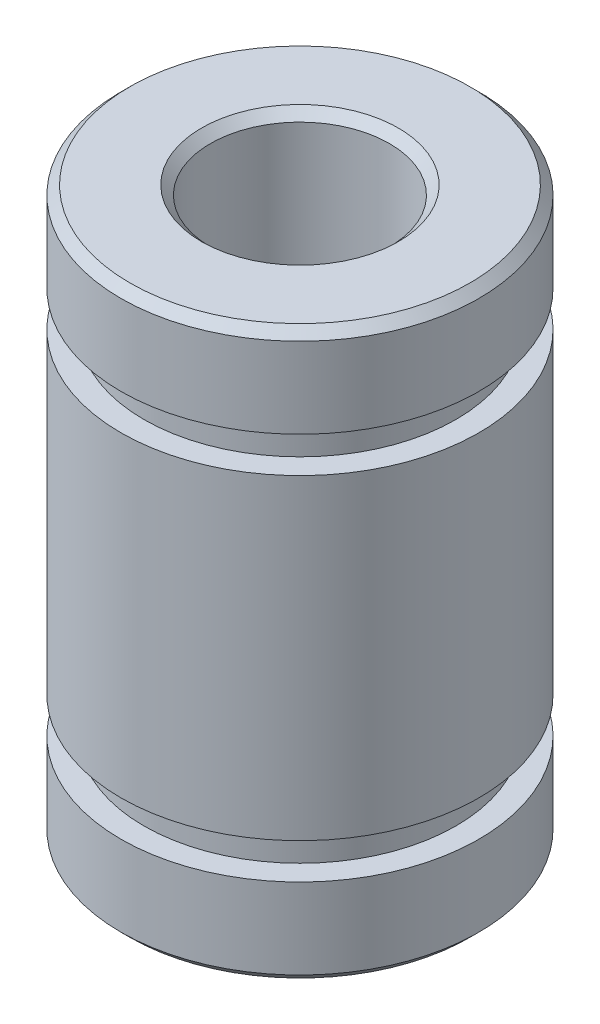
ISO-10303-21;
HEADER;
FILE_DESCRIPTION(('STEP AP214'),'2;1');
FILE_NAME('part.step','',(''),(''),'','','');
FILE_SCHEMA(('AUTOMOTIVE_DESIGN { 1 0 10303 214 1 1 1 1 }'));
ENDSEC;
DATA;
#1=APPLICATION_CONTEXT('core data for automotive mechanical design processes');
#2=APPLICATION_PROTOCOL_DEFINITION('international standard','automotive_design',2000,#1);
#3=PRODUCT_CONTEXT('',#1,'mechanical');
#4=PRODUCT('Part','Part','',(#3));
#5=PRODUCT_RELATED_PRODUCT_CATEGORY('part','',(#4));
#6=PRODUCT_DEFINITION_FORMATION('','',#4);
#7=PRODUCT_DEFINITION_CONTEXT('part definition',#1,'design');
#8=PRODUCT_DEFINITION('design','',#6,#7);
#9=PRODUCT_DEFINITION_SHAPE('','',#8);
#10=(LENGTH_UNIT() NAMED_UNIT(*) SI_UNIT(.MILLI.,.METRE.));
#11=(NAMED_UNIT(*) PLANE_ANGLE_UNIT() SI_UNIT($,.RADIAN.));
#12=(NAMED_UNIT(*) SI_UNIT($,.STERADIAN.) SOLID_ANGLE_UNIT());
#13=UNCERTAINTY_MEASURE_WITH_UNIT(LENGTH_MEASURE(1.E-05),#10,'distance_accuracy_value','');
#14=(GEOMETRIC_REPRESENTATION_CONTEXT(3) GLOBAL_UNCERTAINTY_ASSIGNED_CONTEXT((#13)) GLOBAL_UNIT_ASSIGNED_CONTEXT((#10,
#11,#12)) REPRESENTATION_CONTEXT('',''));
#15=CARTESIAN_POINT('',(0.,0.,0.));
#16=DIRECTION('',(0.,0.,1.));
#17=DIRECTION('',(1.,0.,0.));
#18=AXIS2_PLACEMENT_3D('',#15,#16,#17);
#19=CARTESIAN_POINT('',(0.,9.5,0.));
#20=DIRECTION('',(0.,-1.,0.));
#21=DIRECTION('',(0.,0.,-1.));
#22=AXIS2_PLACEMENT_3D('',#19,#20,#21);
#23=CYLINDRICAL_SURFACE('',#22,6.);
#24=CARTESIAN_POINT('',(0.,9.2,0.));
#25=DIRECTION('',(0.,1.,0.));
#26=DIRECTION('',(0.,0.,1.));
#27=AXIS2_PLACEMENT_3D('',#24,#25,#26);
#28=CIRCLE('',#27,6.);
#29=CARTESIAN_POINT('',(0.,9.2,6.));
#30=VERTEX_POINT('',#29);
#31=EDGE_CURVE('E10',#30,#30,#28,.F.);
#32=ORIENTED_EDGE('',*,*,#31,.T.);
#33=EDGE_LOOP('',(#32));
#34=FACE_BOUND('',#33,.T.);
#35=CARTESIAN_POINT('',(0.,6.5,0.));
#36=DIRECTION('',(0.,1.,0.));
#37=DIRECTION('',(0.,0.,1.));
#38=AXIS2_PLACEMENT_3D('',#35,#36,#37);
#39=CIRCLE('',#38,6.);
#40=CARTESIAN_POINT('',(0.,6.5,6.));
#41=VERTEX_POINT('',#40);
#42=EDGE_CURVE('E73',#41,#41,#39,.T.);
#43=ORIENTED_EDGE('',*,*,#42,.T.);
#44=EDGE_LOOP('',(#43));
#45=FACE_BOUND('',#44,.T.);
#46=ADVANCED_FACE('F36',(#34,#45),#23,.T.);
#47=CARTESIAN_POINT('',(0.,-9.19999999999999,0.));
#48=DIRECTION('',(0.,1.,0.));
#49=DIRECTION('',(0.,0.,1.));
#50=AXIS2_PLACEMENT_3D('',#47,#48,#49);
#51=CIRCLE('',#50,6.);
#52=CARTESIAN_POINT('',(0.,-9.2,6.));
#53=VERTEX_POINT('',#52);
#54=EDGE_CURVE('E52',#53,#53,#51,.T.);
#55=ORIENTED_EDGE('',*,*,#54,.T.);
#56=EDGE_LOOP('',(#55));
#57=FACE_BOUND('',#56,.T.);
#58=CARTESIAN_POINT('',(0.,-6.5,0.));
#59=DIRECTION('',(0.,1.,0.));
#60=DIRECTION('',(0.,0.,1.));
#61=AXIS2_PLACEMENT_3D('',#58,#59,#60);
#62=CIRCLE('',#61,6.);
#63=CARTESIAN_POINT('',(0.,-6.5,6.));
#64=VERTEX_POINT('',#63);
#65=EDGE_CURVE('E80',#64,#64,#62,.T.);
#66=ORIENTED_EDGE('',*,*,#65,.F.);
#67=EDGE_LOOP('',(#66));
#68=FACE_BOUND('',#67,.T.);
#69=ADVANCED_FACE('F112',(#57,#68),#23,.T.);
#70=CARTESIAN_POINT('',(0.,9.5,0.));
#71=DIRECTION('',(0.,1.,0.));
#72=DIRECTION('',(0.,0.,1.));
#73=AXIS2_PLACEMENT_3D('',#70,#71,#72);
#74=PLANE('',#73);
#75=CARTESIAN_POINT('',(0.,9.5,0.));
#76=DIRECTION('',(0.,1.,0.));
#77=DIRECTION('',(0.,0.,1.));
#78=AXIS2_PLACEMENT_3D('',#75,#76,#77);
#79=CIRCLE('',#78,3.30000000000001);
#80=CARTESIAN_POINT('',(0.,9.5,3.30000000000001));
#81=VERTEX_POINT('',#80);
#82=EDGE_CURVE('E44',#81,#81,#79,.F.);
#83=ORIENTED_EDGE('',*,*,#82,.T.);
#84=EDGE_LOOP('',(#83));
#85=FACE_BOUND('',#84,.T.);
#86=CARTESIAN_POINT('',(0.,9.5,0.));
#87=DIRECTION('',(0.,1.,0.));
#88=DIRECTION('',(0.,0.,1.));
#89=AXIS2_PLACEMENT_3D('',#86,#87,#88);
#90=CIRCLE('',#89,5.7);
#91=CARTESIAN_POINT('',(0.,9.5,5.7));
#92=VERTEX_POINT('',#91);
#93=EDGE_CURVE('E48',#92,#92,#90,.T.);
#94=ORIENTED_EDGE('',*,*,#93,.T.);
#95=EDGE_LOOP('',(#94));
#96=FACE_BOUND('',#95,.T.);
#97=ADVANCED_FACE('F118',(#85,#96),#74,.T.);
#98=CARTESIAN_POINT('',(0.,-9.5,0.));
#99=DIRECTION('',(0.,1.,0.));
#100=DIRECTION('',(0.,0.,1.));
#101=AXIS2_PLACEMENT_3D('',#98,#99,#100);
#102=PLANE('',#101);
#103=CARTESIAN_POINT('',(0.,-9.5,0.));
#104=DIRECTION('',(0.,1.,0.));
#105=DIRECTION('',(0.,0.,1.));
#106=AXIS2_PLACEMENT_3D('',#103,#104,#105);
#107=CIRCLE('',#106,3.3);
#108=CARTESIAN_POINT('',(0.,-9.5,3.3));
#109=VERTEX_POINT('',#108);
#110=EDGE_CURVE('E63',#109,#109,#107,.T.);
#111=ORIENTED_EDGE('',*,*,#110,.T.);
#112=EDGE_LOOP('',(#111));
#113=FACE_BOUND('',#112,.T.);
#114=CARTESIAN_POINT('',(0.,-9.5,0.));
#115=DIRECTION('',(0.,1.,0.));
#116=DIRECTION('',(0.,0.,1.));
#117=AXIS2_PLACEMENT_3D('',#114,#115,#116);
#118=CIRCLE('',#117,5.69999999999999);
#119=CARTESIAN_POINT('',(0.,-9.5,5.69999999999999));
#120=VERTEX_POINT('',#119);
#121=EDGE_CURVE('E66',#120,#120,#118,.F.);
#122=ORIENTED_EDGE('',*,*,#121,.T.);
#123=EDGE_LOOP('',(#122));
#124=FACE_BOUND('',#123,.T.);
#125=ADVANCED_FACE('F152',(#113,#124),#102,.F.);
#126=CARTESIAN_POINT('',(0.,9.5,0.));
#127=DIRECTION('',(0.,-1.,0.));
#128=DIRECTION('',(0.,0.,-1.));
#129=AXIS2_PLACEMENT_3D('',#126,#127,#128);
#130=CYLINDRICAL_SURFACE('',#129,3.);
#131=CARTESIAN_POINT('',(0.,-9.2,0.));
#132=DIRECTION('',(0.,1.,0.));
#133=DIRECTION('',(0.,0.,1.));
#134=AXIS2_PLACEMENT_3D('',#131,#132,#133);
#135=CIRCLE('',#134,3.);
#136=CARTESIAN_POINT('',(0.,-9.2,3.));
#137=VERTEX_POINT('',#136);
#138=EDGE_CURVE('E57',#137,#137,#135,.F.);
#139=ORIENTED_EDGE('',*,*,#138,.T.);
#140=EDGE_LOOP('',(#139));
#141=FACE_BOUND('',#140,.T.);
#142=CARTESIAN_POINT('',(0.,9.19999999999999,0.));
#143=DIRECTION('',(0.,1.,0.));
#144=DIRECTION('',(0.,0.,1.));
#145=AXIS2_PLACEMENT_3D('',#142,#143,#144);
#146=CIRCLE('',#145,3.);
#147=CARTESIAN_POINT('',(0.,9.19999999999999,3.));
#148=VERTEX_POINT('',#147);
#149=EDGE_CURVE('E60',#148,#148,#146,.T.);
#150=ORIENTED_EDGE('',*,*,#149,.T.);
#151=EDGE_LOOP('',(#150));
#152=FACE_BOUND('',#151,.T.);
#153=ADVANCED_FACE('F143',(#141,#152),#130,.F.);
#154=CARTESIAN_POINT('',(0.,-5.3,-6.));
#155=DIRECTION('',(0.,-1.,0.));
#156=DIRECTION('',(0.,0.,-1.));
#157=AXIS2_PLACEMENT_3D('',#154,#155,#156);
#158=PLANE('',#157);
#159=CARTESIAN_POINT('',(0.,-5.3,0.));
#160=DIRECTION('',(0.,1.,0.));
#161=DIRECTION('',(0.,0.,1.));
#162=AXIS2_PLACEMENT_3D('',#159,#160,#161);
#163=CIRCLE('',#162,5.22996503655269);
#164=CARTESIAN_POINT('',(0.,-5.3,5.22996503655269));
#165=VERTEX_POINT('',#164);
#166=EDGE_CURVE('E74',#165,#165,#163,.T.);
#167=ORIENTED_EDGE('',*,*,#166,.T.);
#168=EDGE_LOOP('',(#167));
#169=FACE_BOUND('',#168,.T.);
#170=CARTESIAN_POINT('',(0.,-5.3,0.));
#171=DIRECTION('',(0.,1.,0.));
#172=DIRECTION('',(0.,0.,1.));
#173=AXIS2_PLACEMENT_3D('',#170,#171,#172);
#174=CIRCLE('',#173,6.);
#175=CARTESIAN_POINT('',(0.,-5.3,6.));
#176=VERTEX_POINT('',#175);
#177=EDGE_CURVE('E70',#176,#176,#174,.T.);
#178=ORIENTED_EDGE('',*,*,#177,.F.);
#179=EDGE_LOOP('',(#178));
#180=FACE_BOUND('',#179,.T.);
#181=ADVANCED_FACE('F141',(#169,#180),#158,.T.);
#182=CARTESIAN_POINT('',(0.,9.5,0.));
#183=DIRECTION('',(0.,1.,0.));
#184=DIRECTION('',(0.,0.,1.));
#185=AXIS2_PLACEMENT_3D('',#182,#183,#184);
#186=CYLINDRICAL_SURFACE('',#185,5.22996503655269);
#187=CARTESIAN_POINT('',(0.,-6.5,0.));
#188=DIRECTION('',(0.,1.,0.));
#189=DIRECTION('',(0.,0.,1.));
#190=AXIS2_PLACEMENT_3D('',#187,#188,#189);
#191=CIRCLE('',#190,5.22996503655269);
#192=CARTESIAN_POINT('',(0.,-6.5,5.22996503655269));
#193=VERTEX_POINT('',#192);
#194=EDGE_CURVE('E77',#193,#193,#191,.T.);
#195=ORIENTED_EDGE('',*,*,#194,.T.);
#196=EDGE_LOOP('',(#195));
#197=FACE_BOUND('',#196,.T.);
#198=ORIENTED_EDGE('',*,*,#166,.F.);
#199=EDGE_LOOP('',(#198));
#200=FACE_BOUND('',#199,.T.);
#201=ADVANCED_FACE('F130',(#197,#200),#186,.T.);
#202=CARTESIAN_POINT('',(0.,-6.5,-6.));
#203=DIRECTION('',(0.,1.,0.));
#204=DIRECTION('',(0.,0.,1.));
#205=AXIS2_PLACEMENT_3D('',#202,#203,#204);
#206=PLANE('',#205);
#207=ORIENTED_EDGE('',*,*,#65,.T.);
#208=EDGE_LOOP('',(#207));
#209=FACE_BOUND('',#208,.T.);
#210=ORIENTED_EDGE('',*,*,#194,.F.);
#211=EDGE_LOOP('',(#210));
#212=FACE_BOUND('',#211,.T.);
#213=ADVANCED_FACE('F122',(#209,#212),#206,.T.);
#214=ORIENTED_EDGE('',*,*,#177,.T.);
#215=EDGE_LOOP('',(#214));
#216=FACE_BOUND('',#215,.T.);
#217=CARTESIAN_POINT('',(0.,5.3,0.));
#218=DIRECTION('',(0.,1.,0.));
#219=DIRECTION('',(0.,0.,1.));
#220=AXIS2_PLACEMENT_3D('',#217,#218,#219);
#221=CIRCLE('',#220,6.);
#222=CARTESIAN_POINT('',(0.,5.3,6.));
#223=VERTEX_POINT('',#222);
#224=EDGE_CURVE('E69',#223,#223,#221,.T.);
#225=ORIENTED_EDGE('',*,*,#224,.F.);
#226=EDGE_LOOP('',(#225));
#227=FACE_BOUND('',#226,.T.);
#228=ADVANCED_FACE('F114',(#216,#227),#23,.T.);
#229=CARTESIAN_POINT('',(0.,5.3,-6.));
#230=DIRECTION('',(0.,1.,0.));
#231=DIRECTION('',(0.,0.,1.));
#232=AXIS2_PLACEMENT_3D('',#229,#230,#231);
#233=PLANE('',#232);
#234=ORIENTED_EDGE('',*,*,#224,.T.);
#235=EDGE_LOOP('',(#234));
#236=FACE_BOUND('',#235,.T.);
#237=CARTESIAN_POINT('',(0.,5.3,0.));
#238=DIRECTION('',(0.,1.,0.));
#239=DIRECTION('',(0.,0.,1.));
#240=AXIS2_PLACEMENT_3D('',#237,#238,#239);
#241=CIRCLE('',#240,5.22996503655269);
#242=CARTESIAN_POINT('',(0.,5.3,5.22996503655269));
#243=VERTEX_POINT('',#242);
#244=EDGE_CURVE('E85',#243,#243,#241,.T.);
#245=ORIENTED_EDGE('',*,*,#244,.F.);
#246=EDGE_LOOP('',(#245));
#247=FACE_BOUND('',#246,.T.);
#248=ADVANCED_FACE('F108',(#236,#247),#233,.T.);
#249=CARTESIAN_POINT('',(0.,9.5,0.));
#250=DIRECTION('',(0.,1.,0.));
#251=DIRECTION('',(0.,0.,1.));
#252=AXIS2_PLACEMENT_3D('',#249,#250,#251);
#253=CYLINDRICAL_SURFACE('',#252,5.22996503655269);
#254=ORIENTED_EDGE('',*,*,#244,.T.);
#255=EDGE_LOOP('',(#254));
#256=FACE_BOUND('',#255,.T.);
#257=CARTESIAN_POINT('',(0.,6.5,0.));
#258=DIRECTION('',(0.,1.,0.));
#259=DIRECTION('',(0.,0.,1.));
#260=AXIS2_PLACEMENT_3D('',#257,#258,#259);
#261=CIRCLE('',#260,5.22996503655269);
#262=CARTESIAN_POINT('',(0.,6.5,5.22996503655269));
#263=VERTEX_POINT('',#262);
#264=EDGE_CURVE('E88',#263,#263,#261,.T.);
#265=ORIENTED_EDGE('',*,*,#264,.F.);
#266=EDGE_LOOP('',(#265));
#267=FACE_BOUND('',#266,.T.);
#268=ADVANCED_FACE('F98',(#256,#267),#253,.T.);
#269=CARTESIAN_POINT('',(0.,6.5,-6.));
#270=DIRECTION('',(0.,-1.,0.));
#271=DIRECTION('',(0.,0.,-1.));
#272=AXIS2_PLACEMENT_3D('',#269,#270,#271);
#273=PLANE('',#272);
#274=ORIENTED_EDGE('',*,*,#264,.T.);
#275=EDGE_LOOP('',(#274));
#276=FACE_BOUND('',#275,.T.);
#277=ORIENTED_EDGE('',*,*,#42,.F.);
#278=EDGE_LOOP('',(#277));
#279=FACE_BOUND('',#278,.T.);
#280=ADVANCED_FACE('F95',(#276,#279),#273,.T.);
#281=CARTESIAN_POINT('',(0.,-9.5,0.));
#282=DIRECTION('',(0.,-1.,0.));
#283=DIRECTION('',(0.,0.,-1.));
#284=AXIS2_PLACEMENT_3D('',#281,#282,#283);
#285=CONICAL_SURFACE('',#284,3.3,0.785398163397452);
#286=ORIENTED_EDGE('',*,*,#138,.F.);
#287=EDGE_LOOP('',(#286));
#288=FACE_BOUND('',#287,.T.);
#289=ORIENTED_EDGE('',*,*,#110,.F.);
#290=EDGE_LOOP('',(#289));
#291=FACE_BOUND('',#290,.T.);
#292=ADVANCED_FACE('F97',(#288,#291),#285,.F.);
#293=CARTESIAN_POINT('',(0.,-9.19999999999999,0.));
#294=DIRECTION('',(0.,1.,0.));
#295=DIRECTION('',(0.,0.,1.));
#296=AXIS2_PLACEMENT_3D('',#293,#294,#295);
#297=CONICAL_SURFACE('',#296,6.,0.785398163397448);
#298=CARTESIAN_POINT('',(0.,-9.5,5.69999999999999));
#299=CARTESIAN_POINT('',(0.,-9.496875,5.70312499999999));
#300=CARTESIAN_POINT('',(0.,-9.49375,5.70624999999999));
#301=CARTESIAN_POINT('',(0.,-9.4875,5.71249999999999));
#302=CARTESIAN_POINT('',(0.,-9.484375,5.71562499999999));
#303=CARTESIAN_POINT('',(0.,-9.478125,5.72187499999999));
#304=CARTESIAN_POINT('',(0.,-9.475,5.72499999999999));
#305=CARTESIAN_POINT('',(0.,-9.46875,5.73124999999999));
#306=CARTESIAN_POINT('',(0.,-9.465625,5.73437499999999));
#307=CARTESIAN_POINT('',(0.,-9.459375,5.740625));
#308=CARTESIAN_POINT('',(0.,-9.45625,5.74374999999999));
#309=CARTESIAN_POINT('',(0.,-9.45,5.74999999999999));
#310=CARTESIAN_POINT('',(0.,-9.446875,5.75312499999999));
#311=CARTESIAN_POINT('',(0.,-9.440625,5.75937499999999));
#312=CARTESIAN_POINT('',(0.,-9.4375,5.76249999999999));
#313=CARTESIAN_POINT('',(0.,-9.43125,5.76875));
#314=CARTESIAN_POINT('',(0.,-9.428125,5.771875));
#315=CARTESIAN_POINT('',(0.,-9.421875,5.77812499999999));
#316=CARTESIAN_POINT('',(0.,-9.41875,5.78124999999999));
#317=CARTESIAN_POINT('',(0.,-9.4125,5.78749999999999));
#318=CARTESIAN_POINT('',(0.,-9.409375,5.79062499999999));
#319=CARTESIAN_POINT('',(0.,-9.403125,5.796875));
#320=CARTESIAN_POINT('',(0.,-9.4,5.8));
#321=CARTESIAN_POINT('',(0.,-9.39375,5.80624999999999));
#322=CARTESIAN_POINT('',(0.,-9.390625,5.80937499999999));
#323=CARTESIAN_POINT('',(0.,-9.384375,5.815625));
#324=CARTESIAN_POINT('',(0.,-9.38125,5.81875));
#325=CARTESIAN_POINT('',(0.,-9.375,5.825));
#326=CARTESIAN_POINT('',(0.,-9.371875,5.828125));
#327=CARTESIAN_POINT('',(0.,-9.365625,5.834375));
#328=CARTESIAN_POINT('',(0.,-9.3625,5.8375));
#329=CARTESIAN_POINT('',(0.,-9.35625,5.84375));
#330=CARTESIAN_POINT('',(0.,-9.353125,5.846875));
#331=CARTESIAN_POINT('',(0.,-9.346875,5.853125));
#332=CARTESIAN_POINT('',(0.,-9.34375,5.85625));
#333=CARTESIAN_POINT('',(0.,-9.3375,5.8625));
#334=CARTESIAN_POINT('',(0.,-9.334375,5.865625));
#335=CARTESIAN_POINT('',(0.,-9.328125,5.871875));
#336=CARTESIAN_POINT('',(0.,-9.325,5.875));
#337=CARTESIAN_POINT('',(0.,-9.31875,5.88125));
#338=CARTESIAN_POINT('',(0.,-9.315625,5.884375));
#339=CARTESIAN_POINT('',(0.,-9.309375,5.890625));
#340=CARTESIAN_POINT('',(0.,-9.30625,5.89375));
#341=CARTESIAN_POINT('',(0.,-9.3,5.9));
#342=CARTESIAN_POINT('',(0.,-9.296875,5.903125));
#343=CARTESIAN_POINT('',(0.,-9.290625,5.909375));
#344=CARTESIAN_POINT('',(0.,-9.2875,5.9125));
#345=CARTESIAN_POINT('',(0.,-9.28125,5.91875));
#346=CARTESIAN_POINT('',(0.,-9.278125,5.921875));
#347=CARTESIAN_POINT('',(0.,-9.271875,5.928125));
#348=CARTESIAN_POINT('',(0.,-9.26875,5.93125));
#349=CARTESIAN_POINT('',(0.,-9.2625,5.9375));
#350=CARTESIAN_POINT('',(0.,-9.259375,5.940625));
#351=CARTESIAN_POINT('',(0.,-9.253125,5.946875));
#352=CARTESIAN_POINT('',(0.,-9.25,5.95));
#353=CARTESIAN_POINT('',(0.,-9.24375,5.95625));
#354=CARTESIAN_POINT('',(0.,-9.240625,5.959375));
#355=CARTESIAN_POINT('',(0.,-9.234375,5.965625));
#356=CARTESIAN_POINT('',(0.,-9.23125,5.96875));
#357=CARTESIAN_POINT('',(0.,-9.225,5.975));
#358=CARTESIAN_POINT('',(0.,-9.221875,5.978125));
#359=CARTESIAN_POINT('',(0.,-9.215625,5.984375));
#360=CARTESIAN_POINT('',(0.,-9.2125,5.9875));
#361=CARTESIAN_POINT('',(0.,-9.20625,5.99375));
#362=CARTESIAN_POINT('',(0.,-9.20312499999999,5.996875));
#363=CARTESIAN_POINT('',(0.,-9.19999999999999,6.));
#364=B_SPLINE_CURVE_WITH_KNOTS('',3,(#298,#299,#300,#301,#302,#303,#304,#305,#306,#307,#308,
#309,#310,#311,#312,#313,#314,#315,#316,#317,#318,#319,#320,#321,#322,#323,#324,#325,#326,#327,
#328,#329,#330,#331,#332,#333,#334,#335,#336,#337,#338,#339,#340,#341,#342,#343,#344,#345,#346,
#347,#348,#349,#350,#351,#352,#353,#354,#355,#356,#357,#358,#359,#360,#361,#362,#363),
.UNSPECIFIED.,.F.,.F.,(4,2,2,2,2,2,2,2,2,2,2,2,2,2,2,2,2,2,2,2,2,2,2,2,2,2,2,2,2,2,2,2,4),(0.,
0.0132582521472469,0.0265165042944957,0.0397747564417438,0.0530330085889914,0.0662912607362395,
0.0795495128834876,0.0928077650307352,0.106066017177983,0.119324269325231,0.132582521472479,
0.145840773619727,0.159099025766975,0.172357277914223,0.185615530061471,0.19887378220872,
0.212132034355968,0.225390286503215,0.238648538650464,0.251906790797712,0.265165042944959,
0.278423295092207,0.291681547239456,0.304939799386703,0.318198051533951,0.331456303681199,
0.344714555828447,0.357972807975695,0.371231060122943,0.384489312270191,0.397747564417439,
0.411005816564688,0.424264068711936),.UNSPECIFIED.);
#365=EDGE_CURVE('BSEAM105',#120,#53,#364,.T.);
#366=ORIENTED_EDGE('',*,*,#121,.F.);
#367=ORIENTED_EDGE('',*,*,#54,.F.);
#368=ORIENTED_EDGE('',*,*,#365,.T.);
#369=ORIENTED_EDGE('',*,*,#365,.F.);
#370=EDGE_LOOP('',(#366,#368,#367,#369));
#371=FACE_BOUND('',#370,.T.);
#372=ADVANCED_FACE('F105',(#371),#297,.T.);
#373=CARTESIAN_POINT('',(0.,9.19999999999999,0.));
#374=DIRECTION('',(0.,1.,0.));
#375=DIRECTION('',(0.,0.,1.));
#376=AXIS2_PLACEMENT_3D('',#373,#374,#375);
#377=CONICAL_SURFACE('',#376,3.,0.785398163397452);
#378=ORIENTED_EDGE('',*,*,#82,.F.);
#379=EDGE_LOOP('',(#378));
#380=FACE_BOUND('',#379,.T.);
#381=ORIENTED_EDGE('',*,*,#149,.F.);
#382=EDGE_LOOP('',(#381));
#383=FACE_BOUND('',#382,.T.);
#384=ADVANCED_FACE('F167',(#380,#383),#377,.F.);
#385=CARTESIAN_POINT('',(0.,9.5,0.));
#386=DIRECTION('',(0.,-1.,0.));
#387=DIRECTION('',(0.,0.,-1.));
#388=AXIS2_PLACEMENT_3D('',#385,#386,#387);
#389=CONICAL_SURFACE('',#388,5.7,0.785398163397455);
#390=ORIENTED_EDGE('',*,*,#31,.F.);
#391=EDGE_LOOP('',(#390));
#392=FACE_BOUND('',#391,.T.);
#393=ORIENTED_EDGE('',*,*,#93,.F.);
#394=EDGE_LOOP('',(#393));
#395=FACE_BOUND('',#394,.T.);
#396=ADVANCED_FACE('F39',(#392,#395),#389,.T.);
#397=CLOSED_SHELL('',(#46,#69,#97,#125,#153,#181,#201,#213,#228,#248,#268,#280,#292,#372,#384,#396));
#398=MANIFOLD_SOLID_BREP('B2',#397);
#399=ADVANCED_BREP_SHAPE_REPRESENTATION('',(#18,#398),#14);
#400=SHAPE_DEFINITION_REPRESENTATION(#9,#399);
ENDSEC;
END-ISO-10303-21;
